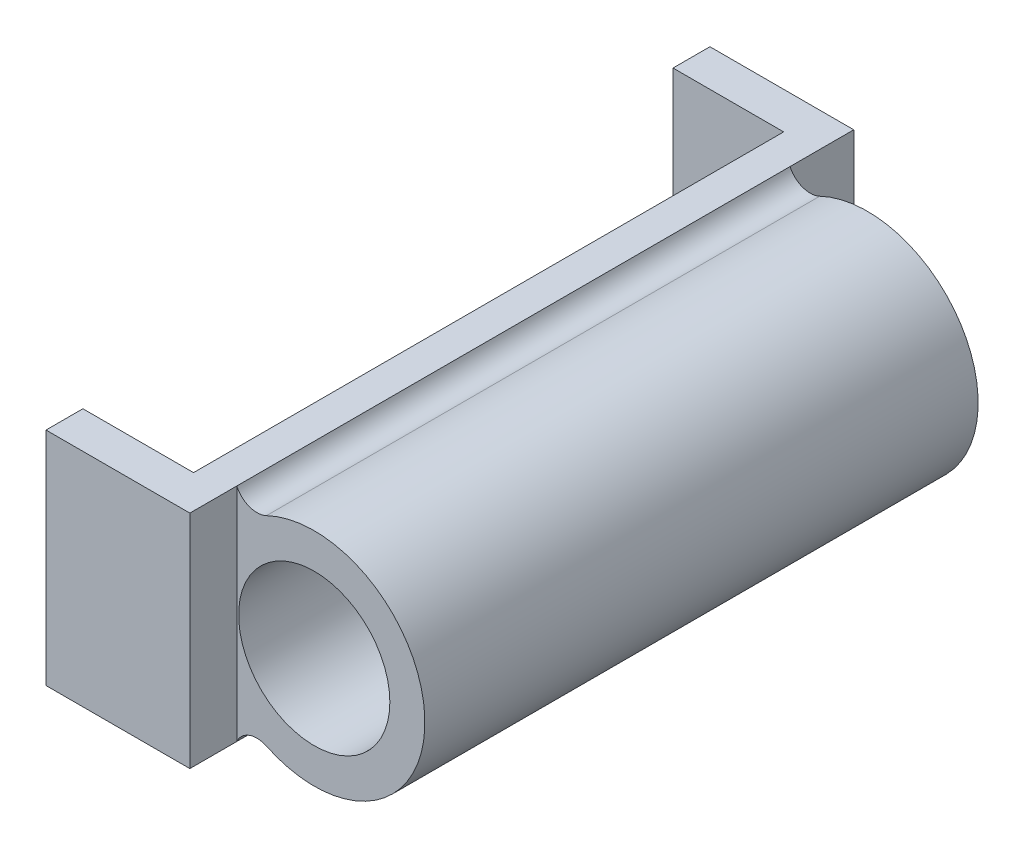
ISO-10303-21;
HEADER;
FILE_DESCRIPTION(('STEP AP214'),'2;1');
FILE_NAME('part.step','',(''),(''),'','','');
FILE_SCHEMA(('AUTOMOTIVE_DESIGN { 1 0 10303 214 1 1 1 1 }'));
ENDSEC;
DATA;
#1=APPLICATION_CONTEXT('core data for automotive mechanical design processes');
#2=APPLICATION_PROTOCOL_DEFINITION('international standard','automotive_design',2000,#1);
#3=PRODUCT_CONTEXT('',#1,'mechanical');
#4=PRODUCT('Part','Part','',(#3));
#5=PRODUCT_RELATED_PRODUCT_CATEGORY('part','',(#4));
#6=PRODUCT_DEFINITION_FORMATION('','',#4);
#7=PRODUCT_DEFINITION_CONTEXT('part definition',#1,'design');
#8=PRODUCT_DEFINITION('design','',#6,#7);
#9=PRODUCT_DEFINITION_SHAPE('','',#8);
#10=(LENGTH_UNIT() NAMED_UNIT(*) SI_UNIT(.MILLI.,.METRE.));
#11=(NAMED_UNIT(*) PLANE_ANGLE_UNIT() SI_UNIT($,.RADIAN.));
#12=(NAMED_UNIT(*) SI_UNIT($,.STERADIAN.) SOLID_ANGLE_UNIT());
#13=UNCERTAINTY_MEASURE_WITH_UNIT(LENGTH_MEASURE(1.E-05),#10,'distance_accuracy_value','');
#14=(GEOMETRIC_REPRESENTATION_CONTEXT(3) GLOBAL_UNCERTAINTY_ASSIGNED_CONTEXT((#13)) GLOBAL_UNIT_ASSIGNED_CONTEXT((#10,
#11,#12)) REPRESENTATION_CONTEXT('',''));
#15=CARTESIAN_POINT('',(0.,0.,0.));
#16=DIRECTION('',(0.,0.,1.));
#17=DIRECTION('',(1.,0.,0.));
#18=AXIS2_PLACEMENT_3D('',#15,#16,#17);
#19=CARTESIAN_POINT('',(-10.5,0.,0.));
#20=DIRECTION('',(1.,0.,0.));
#21=DIRECTION('',(0.,1.,0.));
#22=AXIS2_PLACEMENT_3D('',#19,#20,#21);
#23=PLANE('',#22);
#24=DIRECTION('',(0.,0.,1.));
#25=VECTOR('',#24,1.);
#26=CARTESIAN_POINT('',(-10.5,-15.,-31.3631809895909));
#27=LINE('',#26,#25);
#28=CARTESIAN_POINT('',(-10.5,-15.,52.2736380208183));
#29=VERTEX_POINT('',#28);
#30=CARTESIAN_POINT('',(-10.5,-15.,58.6368190104091));
#31=VERTEX_POINT('',#30);
#32=EDGE_CURVE('E164',#29,#31,#27,.T.);
#33=ORIENTED_EDGE('',*,*,#32,.F.);
#34=DIRECTION('',(0.,-1.,0.));
#35=VECTOR('',#34,1.);
#36=CARTESIAN_POINT('',(-10.5,0.,52.2736380208183));
#37=LINE('',#36,#35);
#38=CARTESIAN_POINT('',(-10.5,15.,52.2736380208183));
#39=VERTEX_POINT('',#38);
#40=EDGE_CURVE('E185',#39,#29,#37,.T.);
#41=ORIENTED_EDGE('',*,*,#40,.F.);
#42=DIRECTION('',(0.,0.,-1.));
#43=VECTOR('',#42,1.);
#44=CARTESIAN_POINT('',(-10.5,15.,-31.3631809895908));
#45=LINE('',#44,#43);
#46=CARTESIAN_POINT('',(-10.5,15.,58.6368190104091));
#47=VERTEX_POINT('',#46);
#48=EDGE_CURVE('E221',#47,#39,#45,.T.);
#49=ORIENTED_EDGE('',*,*,#48,.F.);
#50=DIRECTION('',(0.,-1.,0.));
#51=VECTOR('',#50,1.);
#52=CARTESIAN_POINT('',(-10.5,30.,58.6368190104091));
#53=LINE('',#52,#51);
#54=EDGE_CURVE('E168',#47,#31,#53,.T.);
#55=ORIENTED_EDGE('',*,*,#54,.T.);
#56=EDGE_LOOP('',(#33,#41,#49,#55));
#57=FACE_BOUND('',#56,.T.);
#58=ADVANCED_FACE('F33',(#57),#23,.T.);
#59=CARTESIAN_POINT('',(-15.,0.,0.));
#60=DIRECTION('',(1.,0.,0.));
#61=DIRECTION('',(0.,1.,0.));
#62=AXIS2_PLACEMENT_3D('',#59,#60,#61);
#63=PLANE('',#62);
#64=DIRECTION('',(0.,1.,0.));
#65=VECTOR('',#64,1.);
#66=CARTESIAN_POINT('',(-15.,-30.,-26.3631809895909));
#67=LINE('',#66,#65);
#68=CARTESIAN_POINT('',(-15.,-15.,-26.3631809895909));
#69=VERTEX_POINT('',#68);
#70=CARTESIAN_POINT('',(-15.,15.,-26.3631809895909));
#71=VERTEX_POINT('',#70);
#72=EDGE_CURVE('E209',#69,#71,#67,.T.);
#73=ORIENTED_EDGE('',*,*,#72,.F.);
#74=DIRECTION('',(0.,0.,1.));
#75=VECTOR('',#74,1.);
#76=CARTESIAN_POINT('',(-15.,-15.,0.));
#77=LINE('',#76,#75);
#78=CARTESIAN_POINT('',(-15.,-15.,53.6368190104091));
#79=VERTEX_POINT('',#78);
#80=EDGE_CURVE('E264',#69,#79,#77,.T.);
#81=ORIENTED_EDGE('',*,*,#80,.T.);
#82=DIRECTION('',(0.,-1.,0.));
#83=VECTOR('',#82,1.);
#84=CARTESIAN_POINT('',(-15.,-30.,53.6368190104091));
#85=LINE('',#84,#83);
#86=CARTESIAN_POINT('',(-15.,15.,53.6368190104091));
#87=VERTEX_POINT('',#86);
#88=EDGE_CURVE('E178',#87,#79,#85,.T.);
#89=ORIENTED_EDGE('',*,*,#88,.F.);
#90=DIRECTION('',(0.,0.,-1.));
#91=VECTOR('',#90,1.);
#92=CARTESIAN_POINT('',(-15.,15.,0.));
#93=LINE('',#92,#91);
#94=EDGE_CURVE('E263',#87,#71,#93,.T.);
#95=ORIENTED_EDGE('',*,*,#94,.T.);
#96=EDGE_LOOP('',(#73,#81,#89,#95));
#97=FACE_BOUND('',#96,.T.);
#98=ADVANCED_FACE('F262',(#97),#63,.F.);
#99=CARTESIAN_POINT('',(0.,0.,60.));
#100=DIRECTION('',(0.,0.,-1.));
#101=DIRECTION('',(-1.,0.,0.));
#102=AXIS2_PLACEMENT_3D('',#99,#100,#101);
#103=CYLINDRICAL_SURFACE('',#102,15.);
#104=DIRECTION('',(0.,0.,-1.));
#105=VECTOR('',#104,1.);
#106=CARTESIAN_POINT('',(15.,0.,60.));
#107=LINE('',#106,#105);
#108=CARTESIAN_POINT('',(15.,0.,0.));
#109=VERTEX_POINT('',#108);
#110=CARTESIAN_POINT('',(15.,0.,27.2736380208183));
#111=VERTEX_POINT('',#110);
#112=EDGE_CURVE('E181',#109,#111,#107,.F.);
#113=ORIENTED_EDGE('',*,*,#112,.F.);
#114=ORIENTED_EDGE('',*,*,#112,.T.);
#115=EDGE_LOOP('',(#113,#114));
#116=FACE_BOUND('',#115,.T.);
#117=DIRECTION('',(0.,0.,-1.));
#118=VECTOR('',#117,1.);
#119=CARTESIAN_POINT('',(0.,15.,60.));
#120=LINE('',#119,#118);
#121=CARTESIAN_POINT('',(0.,15.,27.2736380208183));
#122=VERTEX_POINT('',#121);
#123=CARTESIAN_POINT('',(0.,15.,0.));
#124=VERTEX_POINT('',#123);
#125=EDGE_CURVE('E183',#122,#124,#120,.T.);
#126=ORIENTED_EDGE('',*,*,#125,.T.);
#127=ORIENTED_EDGE('',*,*,#125,.F.);
#128=EDGE_LOOP('',(#126,#127));
#129=FACE_BOUND('',#128,.T.);
#130=CARTESIAN_POINT('',(0.,0.,52.2736380208183));
#131=DIRECTION('',(0.,0.,1.));
#132=DIRECTION('',(1.,0.,0.));
#133=AXIS2_PLACEMENT_3D('',#130,#131,#132);
#134=CIRCLE('',#133,15.);
#135=CARTESIAN_POINT('',(-6.47275242437889,-13.5315733029348,52.2736380208183));
#136=VERTEX_POINT('',#135);
#137=CARTESIAN_POINT('',(-6.47275242437889,13.5315733029348,52.2736380208183));
#138=VERTEX_POINT('',#137);
#139=EDGE_CURVE('E218',#136,#138,#134,.T.);
#140=ORIENTED_EDGE('',*,*,#139,.F.);
#141=DIRECTION('',(0.,0.,-1.));
#142=VECTOR('',#141,1.);
#143=CARTESIAN_POINT('',(-6.47275242437889,-13.5315733029348,60.));
#144=LINE('',#143,#142);
#145=CARTESIAN_POINT('',(-6.47275242437889,-13.5315733029348,-22.7263619791817));
#146=VERTEX_POINT('',#145);
#147=EDGE_CURVE('E193',#136,#146,#144,.T.);
#148=ORIENTED_EDGE('',*,*,#147,.T.);
#149=CARTESIAN_POINT('',(0.,0.,-22.7263619791817));
#150=DIRECTION('',(0.,0.,1.));
#151=DIRECTION('',(1.,0.,0.));
#152=AXIS2_PLACEMENT_3D('',#149,#150,#151);
#153=CIRCLE('',#152,15.);
#154=CARTESIAN_POINT('',(-6.47275242437889,13.5315733029348,-22.7263619791817));
#155=VERTEX_POINT('',#154);
#156=EDGE_CURVE('E202',#146,#155,#153,.T.);
#157=ORIENTED_EDGE('',*,*,#156,.T.);
#158=DIRECTION('',(0.,0.,-1.));
#159=VECTOR('',#158,1.);
#160=CARTESIAN_POINT('',(-6.47275242437889,13.5315733029348,60.));
#161=LINE('',#160,#159);
#162=EDGE_CURVE('E48',#155,#138,#161,.F.);
#163=ORIENTED_EDGE('',*,*,#162,.T.);
#164=EDGE_LOOP('',(#140,#148,#157,#163));
#165=FACE_BOUND('',#164,.T.);
#166=DIRECTION('',(0.,0.,-1.));
#167=VECTOR('',#166,1.);
#168=CARTESIAN_POINT('',(0.,-15.,60.));
#169=LINE('',#168,#167);
#170=CARTESIAN_POINT('',(0.,-15.,0.));
#171=VERTEX_POINT('',#170);
#172=CARTESIAN_POINT('',(0.,-15.,27.2736380208183));
#173=VERTEX_POINT('',#172);
#174=EDGE_CURVE('E172',#171,#173,#169,.F.);
#175=ORIENTED_EDGE('',*,*,#174,.F.);
#176=ORIENTED_EDGE('',*,*,#174,.T.);
#177=EDGE_LOOP('',(#175,#176));
#178=FACE_BOUND('',#177,.T.);
#179=ADVANCED_FACE('F206',(#116,#129,#165,#178),#103,.T.);
#180=DIRECTION('',(0.,-1.,0.));
#181=VECTOR('',#180,1.);
#182=CARTESIAN_POINT('',(-10.5,0.,-22.7263619791817));
#183=LINE('',#182,#181);
#184=CARTESIAN_POINT('',(-10.5,15.,-22.7263619791817));
#185=VERTEX_POINT('',#184);
#186=CARTESIAN_POINT('',(-10.5,-15.,-22.7263619791817));
#187=VERTEX_POINT('',#186);
#188=EDGE_CURVE('E160',#185,#187,#183,.T.);
#189=ORIENTED_EDGE('',*,*,#188,.T.);
#190=CARTESIAN_POINT('',(-10.5,-15.,-31.3631809895909));
#191=VERTEX_POINT('',#190);
#192=EDGE_CURVE('E145',#191,#187,#27,.T.);
#193=ORIENTED_EDGE('',*,*,#192,.F.);
#194=DIRECTION('',(0.,1.,0.));
#195=VECTOR('',#194,1.);
#196=CARTESIAN_POINT('',(-10.5,30.,-31.3631809895908));
#197=LINE('',#196,#195);
#198=CARTESIAN_POINT('',(-10.5,15.,-31.3631809895908));
#199=VERTEX_POINT('',#198);
#200=EDGE_CURVE('E159',#191,#199,#197,.T.);
#201=ORIENTED_EDGE('',*,*,#200,.T.);
#202=EDGE_CURVE('E228',#185,#199,#45,.T.);
#203=ORIENTED_EDGE('',*,*,#202,.F.);
#204=EDGE_LOOP('',(#189,#193,#201,#203));
#205=FACE_BOUND('',#204,.T.);
#206=ADVANCED_FACE('F157',(#205),#23,.T.);
#207=CARTESIAN_POINT('',(-10.5,30.,-31.3631809895908));
#208=DIRECTION('',(0.,0.,1.));
#209=DIRECTION('',(0.,-1.,0.));
#210=AXIS2_PLACEMENT_3D('',#207,#208,#209);
#211=PLANE('',#210);
#212=ORIENTED_EDGE('',*,*,#200,.F.);
#213=DIRECTION('',(1.,0.,0.));
#214=VECTOR('',#213,1.);
#215=CARTESIAN_POINT('',(-30.5,-15.,-31.3631809895909));
#216=LINE('',#215,#214);
#217=CARTESIAN_POINT('',(-30.,-15.,-31.3631809895909));
#218=VERTEX_POINT('',#217);
#219=EDGE_CURVE('E141',#218,#191,#216,.T.);
#220=ORIENTED_EDGE('',*,*,#219,.F.);
#221=DIRECTION('',(0.,-1.,0.));
#222=VECTOR('',#221,1.);
#223=CARTESIAN_POINT('',(-30.,-30.,-31.3631809895909));
#224=LINE('',#223,#222);
#225=CARTESIAN_POINT('',(-30.,15.,-31.3631809895909));
#226=VERTEX_POINT('',#225);
#227=EDGE_CURVE('E235',#226,#218,#224,.T.);
#228=ORIENTED_EDGE('',*,*,#227,.F.);
#229=DIRECTION('',(1.,0.,0.));
#230=VECTOR('',#229,1.);
#231=CARTESIAN_POINT('',(-30.5,15.,-31.3631809895908));
#232=LINE('',#231,#230);
#233=EDGE_CURVE('E167',#226,#199,#232,.T.);
#234=ORIENTED_EDGE('',*,*,#233,.T.);
#235=EDGE_LOOP('',(#212,#220,#228,#234));
#236=FACE_BOUND('',#235,.T.);
#237=ADVANCED_FACE('F166',(#236),#211,.F.);
#238=CARTESIAN_POINT('',(-10.5,30.,58.6368190104091));
#239=DIRECTION('',(0.,0.,-1.));
#240=DIRECTION('',(0.,1.,0.));
#241=AXIS2_PLACEMENT_3D('',#238,#239,#240);
#242=PLANE('',#241);
#243=DIRECTION('',(0.,1.,0.));
#244=VECTOR('',#243,1.);
#245=CARTESIAN_POINT('',(-30.,-30.,58.6368190104091));
#246=LINE('',#245,#244);
#247=CARTESIAN_POINT('',(-30.,-15.,58.6368190104091));
#248=VERTEX_POINT('',#247);
#249=CARTESIAN_POINT('',(-30.,15.,58.6368190104091));
#250=VERTEX_POINT('',#249);
#251=EDGE_CURVE('E175',#248,#250,#246,.T.);
#252=ORIENTED_EDGE('',*,*,#251,.F.);
#253=DIRECTION('',(1.,0.,0.));
#254=VECTOR('',#253,1.);
#255=CARTESIAN_POINT('',(-30.5,-15.,58.6368190104091));
#256=LINE('',#255,#254);
#257=EDGE_CURVE('E153',#248,#31,#256,.T.);
#258=ORIENTED_EDGE('',*,*,#257,.T.);
#259=ORIENTED_EDGE('',*,*,#54,.F.);
#260=DIRECTION('',(1.,0.,0.));
#261=VECTOR('',#260,1.);
#262=CARTESIAN_POINT('',(-30.5,15.,58.6368190104091));
#263=LINE('',#262,#261);
#264=EDGE_CURVE('E224',#250,#47,#263,.T.);
#265=ORIENTED_EDGE('',*,*,#264,.F.);
#266=EDGE_LOOP('',(#252,#258,#259,#265));
#267=FACE_BOUND('',#266,.T.);
#268=ADVANCED_FACE('F310',(#267),#242,.F.);
#269=CARTESIAN_POINT('',(-30.,-30.,53.6368190104091));
#270=DIRECTION('',(0.,0.,1.));
#271=DIRECTION('',(1.,0.,0.));
#272=AXIS2_PLACEMENT_3D('',#269,#270,#271);
#273=PLANE('',#272);
#274=ORIENTED_EDGE('',*,*,#88,.T.);
#275=DIRECTION('',(-1.,0.,0.));
#276=VECTOR('',#275,1.);
#277=CARTESIAN_POINT('',(-30.,-15.,53.6368190104091));
#278=LINE('',#277,#276);
#279=CARTESIAN_POINT('',(-30.,-15.,53.6368190104091));
#280=VERTEX_POINT('',#279);
#281=EDGE_CURVE('E256',#79,#280,#278,.T.);
#282=ORIENTED_EDGE('',*,*,#281,.T.);
#283=DIRECTION('',(0.,-1.,0.));
#284=VECTOR('',#283,1.);
#285=CARTESIAN_POINT('',(-30.,-30.,53.6368190104091));
#286=LINE('',#285,#284);
#287=CARTESIAN_POINT('',(-30.,15.,53.6368190104091));
#288=VERTEX_POINT('',#287);
#289=EDGE_CURVE('E169',#288,#280,#286,.T.);
#290=ORIENTED_EDGE('',*,*,#289,.F.);
#291=DIRECTION('',(1.,0.,0.));
#292=VECTOR('',#291,1.);
#293=CARTESIAN_POINT('',(-30.,15.,53.6368190104091));
#294=LINE('',#293,#292);
#295=EDGE_CURVE('E257',#288,#87,#294,.T.);
#296=ORIENTED_EDGE('',*,*,#295,.T.);
#297=EDGE_LOOP('',(#274,#282,#290,#296));
#298=FACE_BOUND('',#297,.T.);
#299=ADVANCED_FACE('F254',(#298),#273,.F.);
#300=CARTESIAN_POINT('',(-30.,0.,0.));
#301=DIRECTION('',(-1.,0.,0.));
#302=DIRECTION('',(0.,-1.,0.));
#303=AXIS2_PLACEMENT_3D('',#300,#301,#302);
#304=PLANE('',#303);
#305=DIRECTION('',(0.,0.,-1.));
#306=VECTOR('',#305,1.);
#307=CARTESIAN_POINT('',(-30.,-15.,0.));
#308=LINE('',#307,#306);
#309=EDGE_CURVE('E268',#248,#280,#308,.T.);
#310=ORIENTED_EDGE('',*,*,#309,.F.);
#311=ORIENTED_EDGE('',*,*,#251,.T.);
#312=DIRECTION('',(0.,0.,1.));
#313=VECTOR('',#312,1.);
#314=CARTESIAN_POINT('',(-30.,15.,0.));
#315=LINE('',#314,#313);
#316=EDGE_CURVE('E270',#288,#250,#315,.T.);
#317=ORIENTED_EDGE('',*,*,#316,.F.);
#318=ORIENTED_EDGE('',*,*,#289,.T.);
#319=EDGE_LOOP('',(#310,#311,#317,#318));
#320=FACE_BOUND('',#319,.T.);
#321=ADVANCED_FACE('F331',(#320),#304,.T.);
#322=CARTESIAN_POINT('',(-30.,-30.,-26.3631809895909));
#323=DIRECTION('',(0.,0.,-1.));
#324=DIRECTION('',(-1.,0.,0.));
#325=AXIS2_PLACEMENT_3D('',#322,#323,#324);
#326=PLANE('',#325);
#327=DIRECTION('',(0.,1.,0.));
#328=VECTOR('',#327,1.);
#329=CARTESIAN_POINT('',(-30.,-30.,-26.3631809895909));
#330=LINE('',#329,#328);
#331=CARTESIAN_POINT('',(-30.,-15.,-26.3631809895909));
#332=VERTEX_POINT('',#331);
#333=CARTESIAN_POINT('',(-30.,15.,-26.3631809895909));
#334=VERTEX_POINT('',#333);
#335=EDGE_CURVE('E237',#332,#334,#330,.T.);
#336=ORIENTED_EDGE('',*,*,#335,.F.);
#337=DIRECTION('',(1.,0.,0.));
#338=VECTOR('',#337,1.);
#339=CARTESIAN_POINT('',(-30.,-15.,-26.3631809895909));
#340=LINE('',#339,#338);
#341=EDGE_CURVE('E266',#332,#69,#340,.T.);
#342=ORIENTED_EDGE('',*,*,#341,.T.);
#343=ORIENTED_EDGE('',*,*,#72,.T.);
#344=DIRECTION('',(-1.,0.,0.));
#345=VECTOR('',#344,1.);
#346=CARTESIAN_POINT('',(-30.,15.,-26.3631809895909));
#347=LINE('',#346,#345);
#348=EDGE_CURVE('E325',#71,#334,#347,.T.);
#349=ORIENTED_EDGE('',*,*,#348,.T.);
#350=EDGE_LOOP('',(#336,#342,#343,#349));
#351=FACE_BOUND('',#350,.T.);
#352=ADVANCED_FACE('F333',(#351),#326,.F.);
#353=CARTESIAN_POINT('',(-30.,0.,0.));
#354=DIRECTION('',(1.,0.,0.));
#355=DIRECTION('',(0.,1.,0.));
#356=AXIS2_PLACEMENT_3D('',#353,#354,#355);
#357=PLANE('',#356);
#358=ORIENTED_EDGE('',*,*,#227,.T.);
#359=DIRECTION('',(0.,0.,1.));
#360=VECTOR('',#359,1.);
#361=CARTESIAN_POINT('',(-30.,-15.,0.));
#362=LINE('',#361,#360);
#363=EDGE_CURVE('E148',#218,#332,#362,.T.);
#364=ORIENTED_EDGE('',*,*,#363,.T.);
#365=ORIENTED_EDGE('',*,*,#335,.T.);
#366=DIRECTION('',(0.,0.,-1.));
#367=VECTOR('',#366,1.);
#368=CARTESIAN_POINT('',(-30.,15.,0.));
#369=LINE('',#368,#367);
#370=EDGE_CURVE('E188',#334,#226,#369,.T.);
#371=ORIENTED_EDGE('',*,*,#370,.T.);
#372=EDGE_LOOP('',(#358,#364,#365,#371));
#373=FACE_BOUND('',#372,.T.);
#374=ADVANCED_FACE('F234',(#373),#357,.F.);
#375=CARTESIAN_POINT('',(0.,0.,52.2736380208183));
#376=DIRECTION('',(0.,0.,1.));
#377=DIRECTION('',(1.,0.,0.));
#378=AXIS2_PLACEMENT_3D('',#375,#376,#377);
#379=PLANE('',#378);
#380=ORIENTED_EDGE('',*,*,#40,.T.);
#381=CARTESIAN_POINT('',(-7.76730290925466,-16.2378879635217,52.2736380208183));
#382=DIRECTION('',(0.,0.,1.));
#383=DIRECTION('',(1.,0.,0.));
#384=AXIS2_PLACEMENT_3D('',#381,#382,#383);
#385=CIRCLE('',#384,3.);
#386=EDGE_CURVE('E55',#29,#136,#385,.F.);
#387=ORIENTED_EDGE('',*,*,#386,.T.);
#388=ORIENTED_EDGE('',*,*,#139,.T.);
#389=CARTESIAN_POINT('',(-7.76730290925467,16.2378879635217,52.2736380208183));
#390=DIRECTION('',(0.,0.,1.));
#391=DIRECTION('',(1.,0.,0.));
#392=AXIS2_PLACEMENT_3D('',#389,#390,#391);
#393=CIRCLE('',#392,3.);
#394=EDGE_CURVE('E11',#138,#39,#393,.F.);
#395=ORIENTED_EDGE('',*,*,#394,.T.);
#396=EDGE_LOOP('',(#380,#387,#388,#395));
#397=FACE_BOUND('',#396,.T.);
#398=CARTESIAN_POINT('',(0.,0.,52.2736380208183));
#399=DIRECTION('',(0.,0.,1.));
#400=DIRECTION('',(1.,0.,0.));
#401=AXIS2_PLACEMENT_3D('',#398,#399,#400);
#402=CIRCLE('',#401,10.25);
#403=CARTESIAN_POINT('',(10.25,0.,52.2736380208183));
#404=VERTEX_POINT('',#403);
#405=EDGE_CURVE('E275',#404,#404,#402,.T.);
#406=ORIENTED_EDGE('',*,*,#405,.F.);
#407=EDGE_LOOP('',(#406));
#408=FACE_BOUND('',#407,.T.);
#409=ADVANCED_FACE('F216',(#397,#408),#379,.T.);
#410=CARTESIAN_POINT('',(0.,0.,-22.7263619791817));
#411=DIRECTION('',(0.,0.,1.));
#412=DIRECTION('',(1.,0.,0.));
#413=AXIS2_PLACEMENT_3D('',#410,#411,#412);
#414=PLANE('',#413);
#415=ORIENTED_EDGE('',*,*,#188,.F.);
#416=CARTESIAN_POINT('',(-7.76730290925467,16.2378879635217,-22.7263619791817));
#417=DIRECTION('',(0.,0.,1.));
#418=DIRECTION('',(1.,0.,0.));
#419=AXIS2_PLACEMENT_3D('',#416,#417,#418);
#420=CIRCLE('',#419,3.);
#421=EDGE_CURVE('E41',#185,#155,#420,.T.);
#422=ORIENTED_EDGE('',*,*,#421,.T.);
#423=ORIENTED_EDGE('',*,*,#156,.F.);
#424=CARTESIAN_POINT('',(-7.76730290925466,-16.2378879635217,-22.7263619791817));
#425=DIRECTION('',(0.,0.,1.));
#426=DIRECTION('',(1.,0.,0.));
#427=AXIS2_PLACEMENT_3D('',#424,#425,#426);
#428=CIRCLE('',#427,3.);
#429=EDGE_CURVE('E196',#146,#187,#428,.T.);
#430=ORIENTED_EDGE('',*,*,#429,.T.);
#431=EDGE_LOOP('',(#415,#422,#423,#430));
#432=FACE_BOUND('',#431,.T.);
#433=CARTESIAN_POINT('',(0.,0.,-22.7263619791817));
#434=DIRECTION('',(0.,0.,1.));
#435=DIRECTION('',(1.,0.,0.));
#436=AXIS2_PLACEMENT_3D('',#433,#434,#435);
#437=CIRCLE('',#436,10.25);
#438=CARTESIAN_POINT('',(10.25,0.,-22.7263619791817));
#439=VERTEX_POINT('',#438);
#440=EDGE_CURVE('E210',#439,#439,#437,.T.);
#441=ORIENTED_EDGE('',*,*,#440,.T.);
#442=EDGE_LOOP('',(#441));
#443=FACE_BOUND('',#442,.T.);
#444=ADVANCED_FACE('F200',(#432,#443),#414,.F.);
#445=CARTESIAN_POINT('',(0.,0.,0.));
#446=DIRECTION('',(0.,0.,1.));
#447=DIRECTION('',(1.,0.,0.));
#448=AXIS2_PLACEMENT_3D('',#445,#446,#447);
#449=CYLINDRICAL_SURFACE('',#448,10.25);
#450=ORIENTED_EDGE('',*,*,#405,.T.);
#451=EDGE_LOOP('',(#450));
#452=FACE_BOUND('',#451,.T.);
#453=ORIENTED_EDGE('',*,*,#440,.F.);
#454=EDGE_LOOP('',(#453));
#455=FACE_BOUND('',#454,.T.);
#456=ADVANCED_FACE('F281',(#452,#455),#449,.F.);
#457=CARTESIAN_POINT('',(-30.5,15.,-31.3631809895908));
#458=DIRECTION('',(0.,-1.,0.));
#459=DIRECTION('',(0.,0.,-1.));
#460=AXIS2_PLACEMENT_3D('',#457,#458,#459);
#461=PLANE('',#460);
#462=ORIENTED_EDGE('',*,*,#316,.T.);
#463=ORIENTED_EDGE('',*,*,#264,.T.);
#464=ORIENTED_EDGE('',*,*,#48,.T.);
#465=EDGE_CURVE('E214',#39,#185,#45,.T.);
#466=ORIENTED_EDGE('',*,*,#465,.T.);
#467=ORIENTED_EDGE('',*,*,#202,.T.);
#468=ORIENTED_EDGE('',*,*,#233,.F.);
#469=ORIENTED_EDGE('',*,*,#370,.F.);
#470=ORIENTED_EDGE('',*,*,#348,.F.);
#471=ORIENTED_EDGE('',*,*,#94,.F.);
#472=ORIENTED_EDGE('',*,*,#295,.F.);
#473=EDGE_LOOP('',(#462,#463,#464,#466,#467,#468,#469,#470,#471,#472));
#474=FACE_BOUND('',#473,.T.);
#475=ADVANCED_FACE('F222',(#474),#461,.F.);
#476=CARTESIAN_POINT('',(-30.5,-15.,-31.3631809895909));
#477=DIRECTION('',(0.,1.,0.));
#478=DIRECTION('',(0.,0.,1.));
#479=AXIS2_PLACEMENT_3D('',#476,#477,#478);
#480=PLANE('',#479);
#481=ORIENTED_EDGE('',*,*,#309,.T.);
#482=ORIENTED_EDGE('',*,*,#281,.F.);
#483=ORIENTED_EDGE('',*,*,#80,.F.);
#484=ORIENTED_EDGE('',*,*,#341,.F.);
#485=ORIENTED_EDGE('',*,*,#363,.F.);
#486=ORIENTED_EDGE('',*,*,#219,.T.);
#487=ORIENTED_EDGE('',*,*,#192,.T.);
#488=EDGE_CURVE('E162',#187,#29,#27,.T.);
#489=ORIENTED_EDGE('',*,*,#488,.T.);
#490=ORIENTED_EDGE('',*,*,#32,.T.);
#491=ORIENTED_EDGE('',*,*,#257,.F.);
#492=EDGE_LOOP('',(#481,#482,#483,#484,#485,#486,#487,#489,#490,#491));
#493=FACE_BOUND('',#492,.T.);
#494=ADVANCED_FACE('F143',(#493),#480,.F.);
#495=CARTESIAN_POINT('',(-7.76730290925466,-16.2378879635217,60.));
#496=DIRECTION('',(0.,0.,-1.));
#497=DIRECTION('',(0.,1.,0.));
#498=AXIS2_PLACEMENT_3D('',#495,#496,#497);
#499=CYLINDRICAL_SURFACE('',#498,3.);
#500=ORIENTED_EDGE('',*,*,#429,.F.);
#501=ORIENTED_EDGE('',*,*,#147,.F.);
#502=ORIENTED_EDGE('',*,*,#386,.F.);
#503=ORIENTED_EDGE('',*,*,#488,.F.);
#504=EDGE_LOOP('',(#500,#501,#502,#503));
#505=FACE_BOUND('',#504,.T.);
#506=ADVANCED_FACE('F315',(#505),#499,.F.);
#507=CARTESIAN_POINT('',(-7.76730290925467,16.2378879635217,60.));
#508=DIRECTION('',(0.,0.,1.));
#509=DIRECTION('',(0.,-1.,0.));
#510=AXIS2_PLACEMENT_3D('',#507,#508,#509);
#511=CYLINDRICAL_SURFACE('',#510,3.);
#512=ORIENTED_EDGE('',*,*,#394,.F.);
#513=ORIENTED_EDGE('',*,*,#162,.F.);
#514=ORIENTED_EDGE('',*,*,#421,.F.);
#515=ORIENTED_EDGE('',*,*,#465,.F.);
#516=EDGE_LOOP('',(#512,#513,#514,#515));
#517=FACE_BOUND('',#516,.T.);
#518=ADVANCED_FACE('F35',(#517),#511,.F.);
#519=CLOSED_SHELL('',(#58,#98,#179,#206,#237,#268,#299,#321,#352,#374,#409,#444,#456,#475,#494,
#506,#518));
#520=MANIFOLD_SOLID_BREP('B2',#519);
#521=ADVANCED_BREP_SHAPE_REPRESENTATION('',(#18,#520),#14);
#522=SHAPE_DEFINITION_REPRESENTATION(#9,#521);
ENDSEC;
END-ISO-10303-21;
